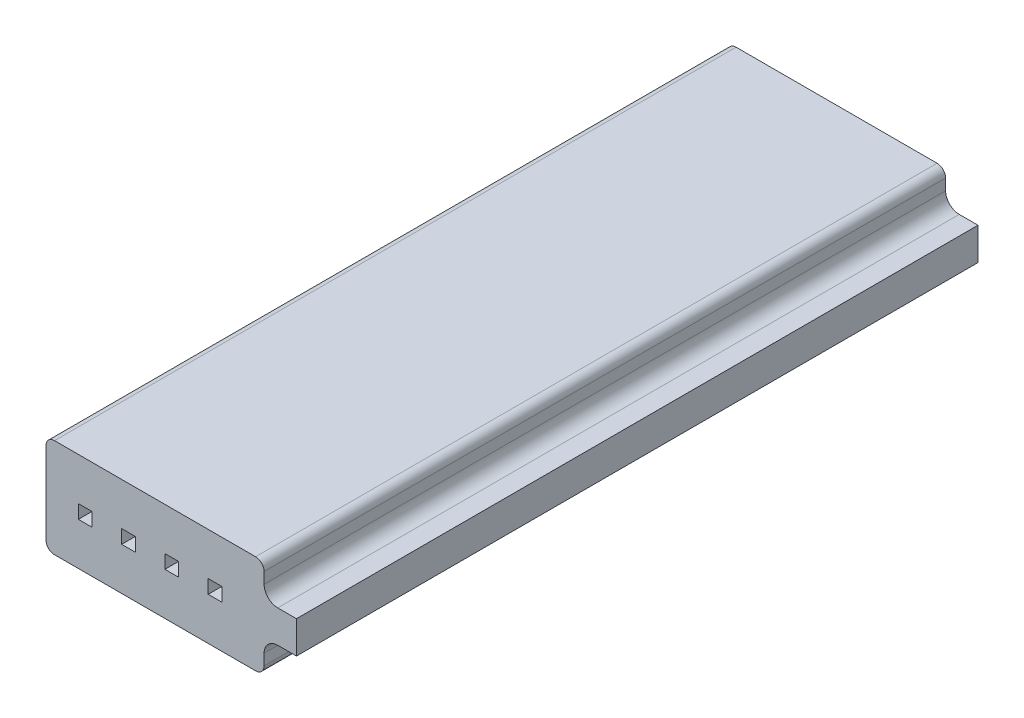
ISO-10303-21;
HEADER;
FILE_DESCRIPTION(('STEP AP214'),'2;1');
FILE_NAME('part.step','',(''),(''),'','','');
FILE_SCHEMA(('AUTOMOTIVE_DESIGN { 1 0 10303 214 1 1 1 1 }'));
ENDSEC;
DATA;
#1=APPLICATION_CONTEXT('core data for automotive mechanical design processes');
#2=APPLICATION_PROTOCOL_DEFINITION('international standard','automotive_design',2000,#1);
#3=PRODUCT_CONTEXT('',#1,'mechanical');
#4=PRODUCT('Part','Part','',(#3));
#5=PRODUCT_RELATED_PRODUCT_CATEGORY('part','',(#4));
#6=PRODUCT_DEFINITION_FORMATION('','',#4);
#7=PRODUCT_DEFINITION_CONTEXT('part definition',#1,'design');
#8=PRODUCT_DEFINITION('design','',#6,#7);
#9=PRODUCT_DEFINITION_SHAPE('','',#8);
#10=(LENGTH_UNIT() NAMED_UNIT(*) SI_UNIT(.MILLI.,.METRE.));
#11=(NAMED_UNIT(*) PLANE_ANGLE_UNIT() SI_UNIT($,.RADIAN.));
#12=(NAMED_UNIT(*) SI_UNIT($,.STERADIAN.) SOLID_ANGLE_UNIT());
#13=UNCERTAINTY_MEASURE_WITH_UNIT(LENGTH_MEASURE(1.E-05),#10,'distance_accuracy_value','');
#14=(GEOMETRIC_REPRESENTATION_CONTEXT(3) GLOBAL_UNCERTAINTY_ASSIGNED_CONTEXT((#13)) GLOBAL_UNIT_ASSIGNED_CONTEXT((#10,
#11,#12)) REPRESENTATION_CONTEXT('',''));
#15=CARTESIAN_POINT('',(0.,0.,0.));
#16=DIRECTION('',(0.,0.,1.));
#17=DIRECTION('',(1.,0.,0.));
#18=AXIS2_PLACEMENT_3D('',#15,#16,#17);
#19=CARTESIAN_POINT('',(3.91999999999999,0.4,40.));
#20=DIRECTION('',(0.,1.,0.));
#21=DIRECTION('',(0.,0.,1.));
#22=AXIS2_PLACEMENT_3D('',#19,#20,#21);
#23=PLANE('',#22);
#24=DIRECTION('',(1.,0.,0.));
#25=VECTOR('',#24,1.);
#26=CARTESIAN_POINT('',(3.91999999999999,0.4,0.));
#27=LINE('',#26,#25);
#28=CARTESIAN_POINT('',(3.11999999999999,0.4,0.));
#29=VERTEX_POINT('',#28);
#30=CARTESIAN_POINT('',(3.91999999999999,0.4,0.));
#31=VERTEX_POINT('',#30);
#32=EDGE_CURVE('E393',#29,#31,#27,.T.);
#33=ORIENTED_EDGE('',*,*,#32,.T.);
#34=DIRECTION('',(0.,0.,-1.));
#35=VECTOR('',#34,1.);
#36=CARTESIAN_POINT('',(3.91999999999999,0.4,40.));
#37=LINE('',#36,#35);
#38=CARTESIAN_POINT('',(3.91999999999999,0.4,40.));
#39=VERTEX_POINT('',#38);
#40=EDGE_CURVE('E414',#39,#31,#37,.T.);
#41=ORIENTED_EDGE('',*,*,#40,.F.);
#42=DIRECTION('',(1.,0.,0.));
#43=VECTOR('',#42,1.);
#44=CARTESIAN_POINT('',(3.91999999999999,0.4,40.));
#45=LINE('',#44,#43);
#46=CARTESIAN_POINT('',(3.11999999999999,0.4,40.));
#47=VERTEX_POINT('',#46);
#48=EDGE_CURVE('E398',#47,#39,#45,.T.);
#49=ORIENTED_EDGE('',*,*,#48,.F.);
#50=DIRECTION('',(0.,0.,-1.));
#51=VECTOR('',#50,1.);
#52=CARTESIAN_POINT('',(3.11999999999999,0.4,40.));
#53=LINE('',#52,#51);
#54=EDGE_CURVE('E405',#47,#29,#53,.T.);
#55=ORIENTED_EDGE('',*,*,#54,.T.);
#56=EDGE_LOOP('',(#33,#41,#49,#55));
#57=FACE_BOUND('',#56,.T.);
#58=ADVANCED_FACE('F36',(#57),#23,.F.);
#59=CARTESIAN_POINT('',(3.91999999999999,0.4,40.));
#60=DIRECTION('',(1.,0.,0.));
#61=DIRECTION('',(0.,0.,-1.));
#62=AXIS2_PLACEMENT_3D('',#59,#60,#61);
#63=PLANE('',#62);
#64=DIRECTION('',(0.,-1.,0.));
#65=VECTOR('',#64,1.);
#66=CARTESIAN_POINT('',(3.91999999999999,0.4,0.));
#67=LINE('',#66,#65);
#68=CARTESIAN_POINT('',(3.91999999999999,-0.4,0.));
#69=VERTEX_POINT('',#68);
#70=EDGE_CURVE('E390',#31,#69,#67,.T.);
#71=ORIENTED_EDGE('',*,*,#70,.T.);
#72=DIRECTION('',(0.,0.,-1.));
#73=VECTOR('',#72,1.);
#74=CARTESIAN_POINT('',(3.91999999999999,-0.4,40.));
#75=LINE('',#74,#73);
#76=CARTESIAN_POINT('',(3.91999999999999,-0.4,40.));
#77=VERTEX_POINT('',#76);
#78=EDGE_CURVE('E411',#77,#69,#75,.T.);
#79=ORIENTED_EDGE('',*,*,#78,.F.);
#80=DIRECTION('',(0.,-1.,0.));
#81=VECTOR('',#80,1.);
#82=CARTESIAN_POINT('',(3.91999999999999,0.4,40.));
#83=LINE('',#82,#81);
#84=EDGE_CURVE('E400',#39,#77,#83,.T.);
#85=ORIENTED_EDGE('',*,*,#84,.F.);
#86=ORIENTED_EDGE('',*,*,#40,.T.);
#87=EDGE_LOOP('',(#71,#79,#85,#86));
#88=FACE_BOUND('',#87,.T.);
#89=ADVANCED_FACE('F533',(#88),#63,.F.);
#90=CARTESIAN_POINT('',(3.91999999999999,-0.4,40.));
#91=DIRECTION('',(0.,-1.,0.));
#92=DIRECTION('',(0.,0.,-1.));
#93=AXIS2_PLACEMENT_3D('',#90,#91,#92);
#94=PLANE('',#93);
#95=DIRECTION('',(-1.,0.,0.));
#96=VECTOR('',#95,1.);
#97=CARTESIAN_POINT('',(3.91999999999999,-0.4,0.));
#98=LINE('',#97,#96);
#99=CARTESIAN_POINT('',(3.11999999999999,-0.4,0.));
#100=VERTEX_POINT('',#99);
#101=EDGE_CURVE('E387',#69,#100,#98,.T.);
#102=ORIENTED_EDGE('',*,*,#101,.T.);
#103=DIRECTION('',(0.,0.,-1.));
#104=VECTOR('',#103,1.);
#105=CARTESIAN_POINT('',(3.11999999999999,-0.4,40.));
#106=LINE('',#105,#104);
#107=CARTESIAN_POINT('',(3.11999999999999,-0.4,40.));
#108=VERTEX_POINT('',#107);
#109=EDGE_CURVE('E408',#108,#100,#106,.T.);
#110=ORIENTED_EDGE('',*,*,#109,.F.);
#111=DIRECTION('',(-1.,0.,0.));
#112=VECTOR('',#111,1.);
#113=CARTESIAN_POINT('',(3.91999999999999,-0.4,40.));
#114=LINE('',#113,#112);
#115=EDGE_CURVE('E402',#77,#108,#114,.T.);
#116=ORIENTED_EDGE('',*,*,#115,.F.);
#117=ORIENTED_EDGE('',*,*,#78,.T.);
#118=EDGE_LOOP('',(#102,#110,#116,#117));
#119=FACE_BOUND('',#118,.T.);
#120=ADVANCED_FACE('F539',(#119),#94,.F.);
#121=CARTESIAN_POINT('',(3.11999999999999,0.4,40.));
#122=DIRECTION('',(-1.,0.,0.));
#123=DIRECTION('',(0.,0.,1.));
#124=AXIS2_PLACEMENT_3D('',#121,#122,#123);
#125=PLANE('',#124);
#126=DIRECTION('',(0.,1.,0.));
#127=VECTOR('',#126,1.);
#128=CARTESIAN_POINT('',(3.11999999999999,0.4,0.));
#129=LINE('',#128,#127);
#130=EDGE_CURVE('E385',#100,#29,#129,.T.);
#131=ORIENTED_EDGE('',*,*,#130,.T.);
#132=ORIENTED_EDGE('',*,*,#54,.F.);
#133=DIRECTION('',(0.,1.,0.));
#134=VECTOR('',#133,1.);
#135=CARTESIAN_POINT('',(3.11999999999999,0.4,40.));
#136=LINE('',#135,#134);
#137=EDGE_CURVE('E396',#108,#47,#136,.T.);
#138=ORIENTED_EDGE('',*,*,#137,.F.);
#139=ORIENTED_EDGE('',*,*,#109,.T.);
#140=EDGE_LOOP('',(#131,#132,#138,#139));
#141=FACE_BOUND('',#140,.T.);
#142=ADVANCED_FACE('F654',(#141),#125,.F.);
#143=CARTESIAN_POINT('',(1.37999999999999,0.4,40.));
#144=DIRECTION('',(0.,1.,0.));
#145=DIRECTION('',(0.,0.,1.));
#146=AXIS2_PLACEMENT_3D('',#143,#144,#145);
#147=PLANE('',#146);
#148=DIRECTION('',(1.,0.,0.));
#149=VECTOR('',#148,1.);
#150=CARTESIAN_POINT('',(1.37999999999999,0.4,0.));
#151=LINE('',#150,#149);
#152=CARTESIAN_POINT('',(0.579999999999991,0.4,0.));
#153=VERTEX_POINT('',#152);
#154=CARTESIAN_POINT('',(1.37999999999999,0.4,0.));
#155=VERTEX_POINT('',#154);
#156=EDGE_CURVE('E361',#153,#155,#151,.T.);
#157=ORIENTED_EDGE('',*,*,#156,.T.);
#158=DIRECTION('',(0.,0.,-1.));
#159=VECTOR('',#158,1.);
#160=CARTESIAN_POINT('',(1.37999999999999,0.4,40.));
#161=LINE('',#160,#159);
#162=CARTESIAN_POINT('',(1.37999999999999,0.4,40.));
#163=VERTEX_POINT('',#162);
#164=EDGE_CURVE('E382',#163,#155,#161,.T.);
#165=ORIENTED_EDGE('',*,*,#164,.F.);
#166=DIRECTION('',(1.,0.,0.));
#167=VECTOR('',#166,1.);
#168=CARTESIAN_POINT('',(1.37999999999999,0.4,40.));
#169=LINE('',#168,#167);
#170=CARTESIAN_POINT('',(0.579999999999991,0.4,40.));
#171=VERTEX_POINT('',#170);
#172=EDGE_CURVE('E366',#171,#163,#169,.T.);
#173=ORIENTED_EDGE('',*,*,#172,.F.);
#174=DIRECTION('',(0.,0.,-1.));
#175=VECTOR('',#174,1.);
#176=CARTESIAN_POINT('',(0.579999999999991,0.4,40.));
#177=LINE('',#176,#175);
#178=EDGE_CURVE('E373',#171,#153,#177,.T.);
#179=ORIENTED_EDGE('',*,*,#178,.T.);
#180=EDGE_LOOP('',(#157,#165,#173,#179));
#181=FACE_BOUND('',#180,.T.);
#182=ADVANCED_FACE('F645',(#181),#147,.F.);
#183=CARTESIAN_POINT('',(1.37999999999999,0.4,40.));
#184=DIRECTION('',(1.,0.,0.));
#185=DIRECTION('',(0.,0.,-1.));
#186=AXIS2_PLACEMENT_3D('',#183,#184,#185);
#187=PLANE('',#186);
#188=DIRECTION('',(0.,-1.,0.));
#189=VECTOR('',#188,1.);
#190=CARTESIAN_POINT('',(1.37999999999999,0.4,0.));
#191=LINE('',#190,#189);
#192=CARTESIAN_POINT('',(1.37999999999999,-0.4,0.));
#193=VERTEX_POINT('',#192);
#194=EDGE_CURVE('E358',#155,#193,#191,.T.);
#195=ORIENTED_EDGE('',*,*,#194,.T.);
#196=DIRECTION('',(0.,0.,-1.));
#197=VECTOR('',#196,1.);
#198=CARTESIAN_POINT('',(1.37999999999999,-0.4,40.));
#199=LINE('',#198,#197);
#200=CARTESIAN_POINT('',(1.37999999999999,-0.4,40.));
#201=VERTEX_POINT('',#200);
#202=EDGE_CURVE('E379',#201,#193,#199,.T.);
#203=ORIENTED_EDGE('',*,*,#202,.F.);
#204=DIRECTION('',(0.,-1.,0.));
#205=VECTOR('',#204,1.);
#206=CARTESIAN_POINT('',(1.37999999999999,0.4,40.));
#207=LINE('',#206,#205);
#208=EDGE_CURVE('E368',#163,#201,#207,.T.);
#209=ORIENTED_EDGE('',*,*,#208,.F.);
#210=ORIENTED_EDGE('',*,*,#164,.T.);
#211=EDGE_LOOP('',(#195,#203,#209,#210));
#212=FACE_BOUND('',#211,.T.);
#213=ADVANCED_FACE('F636',(#212),#187,.F.);
#214=CARTESIAN_POINT('',(1.37999999999999,-0.4,40.));
#215=DIRECTION('',(0.,-1.,0.));
#216=DIRECTION('',(0.,0.,-1.));
#217=AXIS2_PLACEMENT_3D('',#214,#215,#216);
#218=PLANE('',#217);
#219=DIRECTION('',(-1.,0.,0.));
#220=VECTOR('',#219,1.);
#221=CARTESIAN_POINT('',(1.37999999999999,-0.4,0.));
#222=LINE('',#221,#220);
#223=CARTESIAN_POINT('',(0.579999999999991,-0.4,0.));
#224=VERTEX_POINT('',#223);
#225=EDGE_CURVE('E355',#193,#224,#222,.T.);
#226=ORIENTED_EDGE('',*,*,#225,.T.);
#227=DIRECTION('',(0.,0.,-1.));
#228=VECTOR('',#227,1.);
#229=CARTESIAN_POINT('',(0.579999999999991,-0.4,40.));
#230=LINE('',#229,#228);
#231=CARTESIAN_POINT('',(0.579999999999991,-0.4,40.));
#232=VERTEX_POINT('',#231);
#233=EDGE_CURVE('E376',#232,#224,#230,.T.);
#234=ORIENTED_EDGE('',*,*,#233,.F.);
#235=DIRECTION('',(-1.,0.,0.));
#236=VECTOR('',#235,1.);
#237=CARTESIAN_POINT('',(1.37999999999999,-0.4,40.));
#238=LINE('',#237,#236);
#239=EDGE_CURVE('E370',#201,#232,#238,.T.);
#240=ORIENTED_EDGE('',*,*,#239,.F.);
#241=ORIENTED_EDGE('',*,*,#202,.T.);
#242=EDGE_LOOP('',(#226,#234,#240,#241));
#243=FACE_BOUND('',#242,.T.);
#244=ADVANCED_FACE('F627',(#243),#218,.F.);
#245=CARTESIAN_POINT('',(0.579999999999991,0.4,40.));
#246=DIRECTION('',(-1.,0.,0.));
#247=DIRECTION('',(0.,0.,1.));
#248=AXIS2_PLACEMENT_3D('',#245,#246,#247);
#249=PLANE('',#248);
#250=DIRECTION('',(0.,1.,0.));
#251=VECTOR('',#250,1.);
#252=CARTESIAN_POINT('',(0.579999999999991,0.4,0.));
#253=LINE('',#252,#251);
#254=EDGE_CURVE('E353',#224,#153,#253,.T.);
#255=ORIENTED_EDGE('',*,*,#254,.T.);
#256=ORIENTED_EDGE('',*,*,#178,.F.);
#257=DIRECTION('',(0.,1.,0.));
#258=VECTOR('',#257,1.);
#259=CARTESIAN_POINT('',(0.579999999999991,0.4,40.));
#260=LINE('',#259,#258);
#261=EDGE_CURVE('E364',#232,#171,#260,.T.);
#262=ORIENTED_EDGE('',*,*,#261,.F.);
#263=ORIENTED_EDGE('',*,*,#233,.T.);
#264=EDGE_LOOP('',(#255,#256,#262,#263));
#265=FACE_BOUND('',#264,.T.);
#266=ADVANCED_FACE('F622',(#265),#249,.F.);
#267=CARTESIAN_POINT('',(6.39999999999999,-0.950000000000005,40.));
#268=DIRECTION('',(-1.,0.,0.));
#269=DIRECTION('',(0.,0.,1.));
#270=AXIS2_PLACEMENT_3D('',#267,#268,#269);
#271=PLANE('',#270);
#272=DIRECTION('',(0.,1.,0.));
#273=VECTOR('',#272,1.);
#274=CARTESIAN_POINT('',(6.39999999999999,-0.950000000000005,40.));
#275=LINE('',#274,#273);
#276=CARTESIAN_POINT('',(6.39999999999999,-2.4,40.));
#277=VERTEX_POINT('',#276);
#278=CARTESIAN_POINT('',(6.39999999999999,-1.75,40.));
#279=VERTEX_POINT('',#278);
#280=EDGE_CURVE('E309',#277,#279,#275,.T.);
#281=ORIENTED_EDGE('',*,*,#280,.F.);
#282=DIRECTION('',(0.,0.,-1.));
#283=VECTOR('',#282,1.);
#284=CARTESIAN_POINT('',(6.39999999999999,-2.4,40.));
#285=LINE('',#284,#283);
#286=CARTESIAN_POINT('',(6.39999999999999,-2.4,0.));
#287=VERTEX_POINT('',#286);
#288=EDGE_CURVE('E437',#277,#287,#285,.T.);
#289=ORIENTED_EDGE('',*,*,#288,.T.);
#290=DIRECTION('',(0.,1.,0.));
#291=VECTOR('',#290,1.);
#292=CARTESIAN_POINT('',(6.39999999999999,-0.950000000000005,0.));
#293=LINE('',#292,#291);
#294=CARTESIAN_POINT('',(6.39999999999999,-1.75,0.));
#295=VERTEX_POINT('',#294);
#296=EDGE_CURVE('E302',#287,#295,#293,.T.);
#297=ORIENTED_EDGE('',*,*,#296,.T.);
#298=DIRECTION('',(0.,0.,-1.));
#299=VECTOR('',#298,1.);
#300=CARTESIAN_POINT('',(6.39999999999999,-1.75,40.));
#301=LINE('',#300,#299);
#302=EDGE_CURVE('E420',#295,#279,#301,.F.);
#303=ORIENTED_EDGE('',*,*,#302,.T.);
#304=EDGE_LOOP('',(#281,#289,#297,#303));
#305=FACE_BOUND('',#304,.T.);
#306=ADVANCED_FACE('F498',(#305),#271,.F.);
#307=CARTESIAN_POINT('',(8.29999999999999,-0.949999999999996,40.));
#308=DIRECTION('',(0.,1.,0.));
#309=DIRECTION('',(-1.,0.,0.));
#310=AXIS2_PLACEMENT_3D('',#307,#308,#309);
#311=PLANE('',#310);
#312=DIRECTION('',(1.,0.,0.));
#313=VECTOR('',#312,1.);
#314=CARTESIAN_POINT('',(8.29999999999999,-0.949999999999996,40.));
#315=LINE('',#314,#313);
#316=CARTESIAN_POINT('',(7.19999999999999,-0.950000000000001,40.));
#317=VERTEX_POINT('',#316);
#318=CARTESIAN_POINT('',(8.29999999999999,-0.949999999999996,40.));
#319=VERTEX_POINT('',#318);
#320=EDGE_CURVE('E311',#317,#319,#315,.T.);
#321=ORIENTED_EDGE('',*,*,#320,.F.);
#322=DIRECTION('',(0.,0.,-1.));
#323=VECTOR('',#322,1.);
#324=CARTESIAN_POINT('',(7.19999999999999,-0.950000000000001,0.));
#325=LINE('',#324,#323);
#326=CARTESIAN_POINT('',(7.19999999999999,-0.950000000000001,0.));
#327=VERTEX_POINT('',#326);
#328=EDGE_CURVE('E417',#317,#327,#325,.T.);
#329=ORIENTED_EDGE('',*,*,#328,.T.);
#330=DIRECTION('',(1.,0.,0.));
#331=VECTOR('',#330,1.);
#332=CARTESIAN_POINT('',(8.29999999999999,-0.949999999999996,0.));
#333=LINE('',#332,#331);
#334=CARTESIAN_POINT('',(8.29999999999999,-0.949999999999996,0.));
#335=VERTEX_POINT('',#334);
#336=EDGE_CURVE('E331',#327,#335,#333,.T.);
#337=ORIENTED_EDGE('',*,*,#336,.T.);
#338=DIRECTION('',(0.,0.,-1.));
#339=VECTOR('',#338,1.);
#340=CARTESIAN_POINT('',(8.29999999999999,-0.949999999999996,40.));
#341=LINE('',#340,#339);
#342=EDGE_CURVE('E350',#319,#335,#341,.T.);
#343=ORIENTED_EDGE('',*,*,#342,.F.);
#344=EDGE_LOOP('',(#321,#329,#337,#343));
#345=FACE_BOUND('',#344,.T.);
#346=ADVANCED_FACE('F509',(#345),#311,.F.);
#347=CARTESIAN_POINT('',(8.29999999999999,0.950000000000004,40.));
#348=DIRECTION('',(-1.,0.,0.));
#349=DIRECTION('',(0.,0.,1.));
#350=AXIS2_PLACEMENT_3D('',#347,#348,#349);
#351=PLANE('',#350);
#352=DIRECTION('',(0.,1.,0.));
#353=VECTOR('',#352,1.);
#354=CARTESIAN_POINT('',(8.29999999999999,0.950000000000004,0.));
#355=LINE('',#354,#353);
#356=CARTESIAN_POINT('',(8.29999999999999,0.950000000000004,0.));
#357=VERTEX_POINT('',#356);
#358=EDGE_CURVE('E333',#335,#357,#355,.T.);
#359=ORIENTED_EDGE('',*,*,#358,.T.);
#360=DIRECTION('',(0.,0.,-1.));
#361=VECTOR('',#360,1.);
#362=CARTESIAN_POINT('',(8.29999999999999,0.950000000000004,40.));
#363=LINE('',#362,#361);
#364=CARTESIAN_POINT('',(8.29999999999999,0.950000000000004,40.));
#365=VERTEX_POINT('',#364);
#366=EDGE_CURVE('E329',#365,#357,#363,.T.);
#367=ORIENTED_EDGE('',*,*,#366,.F.);
#368=DIRECTION('',(0.,1.,0.));
#369=VECTOR('',#368,1.);
#370=CARTESIAN_POINT('',(8.29999999999999,0.950000000000004,40.));
#371=LINE('',#370,#369);
#372=EDGE_CURVE('E314',#319,#365,#371,.T.);
#373=ORIENTED_EDGE('',*,*,#372,.F.);
#374=ORIENTED_EDGE('',*,*,#342,.T.);
#375=EDGE_LOOP('',(#359,#367,#373,#374));
#376=FACE_BOUND('',#375,.T.);
#377=ADVANCED_FACE('F513',(#376),#351,.F.);
#378=CARTESIAN_POINT('',(6.39999999999999,0.950000000000004,40.));
#379=DIRECTION('',(0.,-1.,0.));
#380=DIRECTION('',(0.,0.,-1.));
#381=AXIS2_PLACEMENT_3D('',#378,#379,#380);
#382=PLANE('',#381);
#383=DIRECTION('',(-1.,0.,0.));
#384=VECTOR('',#383,1.);
#385=CARTESIAN_POINT('',(6.39999999999999,0.950000000000004,0.));
#386=LINE('',#385,#384);
#387=CARTESIAN_POINT('',(7.19999999999999,0.950000000000004,0.));
#388=VERTEX_POINT('',#387);
#389=EDGE_CURVE('E335',#357,#388,#386,.T.);
#390=ORIENTED_EDGE('',*,*,#389,.T.);
#391=DIRECTION('',(0.,0.,-1.));
#392=VECTOR('',#391,1.);
#393=CARTESIAN_POINT('',(7.19999999999999,0.950000000000004,40.));
#394=LINE('',#393,#392);
#395=CARTESIAN_POINT('',(7.19999999999999,0.950000000000004,40.));
#396=VERTEX_POINT('',#395);
#397=EDGE_CURVE('E426',#388,#396,#394,.F.);
#398=ORIENTED_EDGE('',*,*,#397,.T.);
#399=DIRECTION('',(-1.,0.,0.));
#400=VECTOR('',#399,1.);
#401=CARTESIAN_POINT('',(6.39999999999999,0.950000000000004,40.));
#402=LINE('',#401,#400);
#403=EDGE_CURVE('E316',#365,#396,#402,.T.);
#404=ORIENTED_EDGE('',*,*,#403,.F.);
#405=ORIENTED_EDGE('',*,*,#366,.T.);
#406=EDGE_LOOP('',(#390,#398,#404,#405));
#407=FACE_BOUND('',#406,.T.);
#408=ADVANCED_FACE('F758',(#407),#382,.F.);
#409=CARTESIAN_POINT('',(6.39999999999999,2.9,40.));
#410=DIRECTION('',(-1.,0.,0.));
#411=DIRECTION('',(0.,-1.,0.));
#412=AXIS2_PLACEMENT_3D('',#409,#410,#411);
#413=PLANE('',#412);
#414=DIRECTION('',(0.,1.,0.));
#415=VECTOR('',#414,1.);
#416=CARTESIAN_POINT('',(6.39999999999999,2.9,0.));
#417=LINE('',#416,#415);
#418=CARTESIAN_POINT('',(6.39999999999999,1.75,0.));
#419=VERTEX_POINT('',#418);
#420=CARTESIAN_POINT('',(6.39999999999999,2.4,0.));
#421=VERTEX_POINT('',#420);
#422=EDGE_CURVE('E338',#419,#421,#417,.T.);
#423=ORIENTED_EDGE('',*,*,#422,.T.);
#424=DIRECTION('',(0.,0.,-1.));
#425=VECTOR('',#424,1.);
#426=CARTESIAN_POINT('',(6.39999999999999,2.4,40.));
#427=LINE('',#426,#425);
#428=CARTESIAN_POINT('',(6.39999999999999,2.4,40.));
#429=VERTEX_POINT('',#428);
#430=EDGE_CURVE('E11',#421,#429,#427,.F.);
#431=ORIENTED_EDGE('',*,*,#430,.T.);
#432=DIRECTION('',(0.,1.,0.));
#433=VECTOR('',#432,1.);
#434=CARTESIAN_POINT('',(6.39999999999999,2.9,40.));
#435=LINE('',#434,#433);
#436=CARTESIAN_POINT('',(6.39999999999999,1.75,40.));
#437=VERTEX_POINT('',#436);
#438=EDGE_CURVE('E319',#437,#429,#435,.T.);
#439=ORIENTED_EDGE('',*,*,#438,.F.);
#440=DIRECTION('',(0.,0.,-1.));
#441=VECTOR('',#440,1.);
#442=CARTESIAN_POINT('',(6.39999999999999,1.75,0.));
#443=LINE('',#442,#441);
#444=EDGE_CURVE('E423',#437,#419,#443,.T.);
#445=ORIENTED_EDGE('',*,*,#444,.T.);
#446=EDGE_LOOP('',(#423,#431,#439,#445));
#447=FACE_BOUND('',#446,.T.);
#448=ADVANCED_FACE('F524',(#447),#413,.F.);
#449=CARTESIAN_POINT('',(-6.40000000000001,2.9,40.));
#450=DIRECTION('',(0.,-1.,0.));
#451=DIRECTION('',(1.,0.,0.));
#452=AXIS2_PLACEMENT_3D('',#449,#450,#451);
#453=PLANE('',#452);
#454=DIRECTION('',(-1.,0.,0.));
#455=VECTOR('',#454,1.);
#456=CARTESIAN_POINT('',(-6.40000000000001,2.9,0.));
#457=LINE('',#456,#455);
#458=CARTESIAN_POINT('',(5.89999999999999,2.9,0.));
#459=VERTEX_POINT('',#458);
#460=CARTESIAN_POINT('',(-5.90000000000001,2.9,0.));
#461=VERTEX_POINT('',#460);
#462=EDGE_CURVE('E341',#459,#461,#457,.T.);
#463=ORIENTED_EDGE('',*,*,#462,.T.);
#464=DIRECTION('',(0.,0.,-1.));
#465=VECTOR('',#464,1.);
#466=CARTESIAN_POINT('',(-5.90000000000001,2.9,40.));
#467=LINE('',#466,#465);
#468=CARTESIAN_POINT('',(-5.90000000000001,2.9,40.));
#469=VERTEX_POINT('',#468);
#470=EDGE_CURVE('E44',#461,#469,#467,.F.);
#471=ORIENTED_EDGE('',*,*,#470,.T.);
#472=DIRECTION('',(-1.,0.,0.));
#473=VECTOR('',#472,1.);
#474=CARTESIAN_POINT('',(-6.40000000000001,2.9,40.));
#475=LINE('',#474,#473);
#476=CARTESIAN_POINT('',(5.89999999999999,2.9,40.));
#477=VERTEX_POINT('',#476);
#478=EDGE_CURVE('E322',#477,#469,#475,.T.);
#479=ORIENTED_EDGE('',*,*,#478,.F.);
#480=DIRECTION('',(0.,0.,-1.));
#481=VECTOR('',#480,1.);
#482=CARTESIAN_POINT('',(5.89999999999999,2.9,40.));
#483=LINE('',#482,#481);
#484=EDGE_CURVE('E464',#477,#459,#483,.T.);
#485=ORIENTED_EDGE('',*,*,#484,.T.);
#486=EDGE_LOOP('',(#463,#471,#479,#485));
#487=FACE_BOUND('',#486,.T.);
#488=ADVANCED_FACE('F469',(#487),#453,.F.);
#489=CARTESIAN_POINT('',(-6.40000000000001,2.9,40.));
#490=DIRECTION('',(1.,0.,0.));
#491=DIRECTION('',(0.,0.,-1.));
#492=AXIS2_PLACEMENT_3D('',#489,#490,#491);
#493=PLANE('',#492);
#494=DIRECTION('',(0.,-1.,0.));
#495=VECTOR('',#494,1.);
#496=CARTESIAN_POINT('',(-6.40000000000001,2.9,0.));
#497=LINE('',#496,#495);
#498=CARTESIAN_POINT('',(-6.40000000000001,2.4,0.));
#499=VERTEX_POINT('',#498);
#500=CARTESIAN_POINT('',(-6.40000000000001,-2.4,0.));
#501=VERTEX_POINT('',#500);
#502=EDGE_CURVE('E344',#499,#501,#497,.T.);
#503=ORIENTED_EDGE('',*,*,#502,.T.);
#504=DIRECTION('',(0.,0.,-1.));
#505=VECTOR('',#504,1.);
#506=CARTESIAN_POINT('',(-6.40000000000001,-2.4,40.));
#507=LINE('',#506,#505);
#508=CARTESIAN_POINT('',(-6.40000000000001,-2.4,40.));
#509=VERTEX_POINT('',#508);
#510=EDGE_CURVE('E51',#501,#509,#507,.F.);
#511=ORIENTED_EDGE('',*,*,#510,.T.);
#512=DIRECTION('',(0.,-1.,0.));
#513=VECTOR('',#512,1.);
#514=CARTESIAN_POINT('',(-6.40000000000001,2.9,40.));
#515=LINE('',#514,#513);
#516=CARTESIAN_POINT('',(-6.40000000000001,2.4,40.));
#517=VERTEX_POINT('',#516);
#518=EDGE_CURVE('E324',#517,#509,#515,.T.);
#519=ORIENTED_EDGE('',*,*,#518,.F.);
#520=DIRECTION('',(0.,0.,-1.));
#521=VECTOR('',#520,1.);
#522=CARTESIAN_POINT('',(-6.40000000000001,2.4,40.));
#523=LINE('',#522,#521);
#524=EDGE_CURVE('E460',#517,#499,#523,.T.);
#525=ORIENTED_EDGE('',*,*,#524,.T.);
#526=EDGE_LOOP('',(#503,#511,#519,#525));
#527=FACE_BOUND('',#526,.T.);
#528=ADVANCED_FACE('F479',(#527),#493,.F.);
#529=CARTESIAN_POINT('',(-6.40000000000001,-2.9,40.));
#530=DIRECTION('',(0.,1.,0.));
#531=DIRECTION('',(-1.,0.,0.));
#532=AXIS2_PLACEMENT_3D('',#529,#530,#531);
#533=PLANE('',#532);
#534=DIRECTION('',(1.,0.,0.));
#535=VECTOR('',#534,1.);
#536=CARTESIAN_POINT('',(-6.40000000000001,-2.9,0.));
#537=LINE('',#536,#535);
#538=CARTESIAN_POINT('',(-5.90000000000001,-2.9,0.));
#539=VERTEX_POINT('',#538);
#540=CARTESIAN_POINT('',(5.89999999999999,-2.9,0.));
#541=VERTEX_POINT('',#540);
#542=EDGE_CURVE('E312',#539,#541,#537,.T.);
#543=ORIENTED_EDGE('',*,*,#542,.T.);
#544=DIRECTION('',(0.,0.,-1.));
#545=VECTOR('',#544,1.);
#546=CARTESIAN_POINT('',(5.89999999999999,-2.9,40.));
#547=LINE('',#546,#545);
#548=CARTESIAN_POINT('',(5.89999999999999,-2.9,40.));
#549=VERTEX_POINT('',#548);
#550=EDGE_CURVE('E451',#541,#549,#547,.F.);
#551=ORIENTED_EDGE('',*,*,#550,.T.);
#552=DIRECTION('',(1.,0.,0.));
#553=VECTOR('',#552,1.);
#554=CARTESIAN_POINT('',(-6.40000000000001,-2.9,40.));
#555=LINE('',#554,#553);
#556=CARTESIAN_POINT('',(-5.90000000000001,-2.9,40.));
#557=VERTEX_POINT('',#556);
#558=EDGE_CURVE('E326',#557,#549,#555,.T.);
#559=ORIENTED_EDGE('',*,*,#558,.F.);
#560=DIRECTION('',(0.,0.,-1.));
#561=VECTOR('',#560,1.);
#562=CARTESIAN_POINT('',(-5.90000000000001,-2.9,40.));
#563=LINE('',#562,#561);
#564=EDGE_CURVE('E448',#557,#539,#563,.T.);
#565=ORIENTED_EDGE('',*,*,#564,.T.);
#566=EDGE_LOOP('',(#543,#551,#559,#565));
#567=FACE_BOUND('',#566,.T.);
#568=ADVANCED_FACE('F490',(#567),#533,.F.);
#569=CARTESIAN_POINT('',(0.,0.,40.));
#570=DIRECTION('',(0.,0.,1.));
#571=DIRECTION('',(1.,0.,0.));
#572=AXIS2_PLACEMENT_3D('',#569,#570,#571);
#573=PLANE('',#572);
#574=DIRECTION('',(0.,1.,0.));
#575=VECTOR('',#574,1.);
#576=CARTESIAN_POINT('',(-1.96000000000001,0.4,40.));
#577=LINE('',#576,#575);
#578=CARTESIAN_POINT('',(-1.96000000000001,-0.4,40.));
#579=VERTEX_POINT('',#578);
#580=CARTESIAN_POINT('',(-1.96000000000001,0.4,40.));
#581=VERTEX_POINT('',#580);
#582=EDGE_CURVE('E273',#579,#581,#577,.T.);
#583=ORIENTED_EDGE('',*,*,#582,.T.);
#584=DIRECTION('',(1.,0.,0.));
#585=VECTOR('',#584,1.);
#586=CARTESIAN_POINT('',(-1.16000000000001,0.4,40.));
#587=LINE('',#586,#585);
#588=CARTESIAN_POINT('',(-1.16000000000001,0.4,40.));
#589=VERTEX_POINT('',#588);
#590=EDGE_CURVE('E245',#581,#589,#587,.T.);
#591=ORIENTED_EDGE('',*,*,#590,.T.);
#592=DIRECTION('',(0.,-1.,0.));
#593=VECTOR('',#592,1.);
#594=CARTESIAN_POINT('',(-1.16000000000001,0.4,40.));
#595=LINE('',#594,#593);
#596=CARTESIAN_POINT('',(-1.16000000000001,-0.4,40.));
#597=VERTEX_POINT('',#596);
#598=EDGE_CURVE('E252',#589,#597,#595,.T.);
#599=ORIENTED_EDGE('',*,*,#598,.T.);
#600=DIRECTION('',(-1.,0.,0.));
#601=VECTOR('',#600,1.);
#602=CARTESIAN_POINT('',(-1.16000000000001,-0.4,40.));
#603=LINE('',#602,#601);
#604=EDGE_CURVE('E268',#597,#579,#603,.T.);
#605=ORIENTED_EDGE('',*,*,#604,.T.);
#606=EDGE_LOOP('',(#583,#591,#599,#605));
#607=FACE_BOUND('',#606,.T.);
#608=DIRECTION('',(0.,1.,0.));
#609=VECTOR('',#608,1.);
#610=CARTESIAN_POINT('',(-4.50000000000001,0.4,40.));
#611=LINE('',#610,#609);
#612=CARTESIAN_POINT('',(-4.50000000000001,-0.4,40.));
#613=VERTEX_POINT('',#612);
#614=CARTESIAN_POINT('',(-4.50000000000001,0.4,40.));
#615=VERTEX_POINT('',#614);
#616=EDGE_CURVE('E277',#613,#615,#611,.T.);
#617=ORIENTED_EDGE('',*,*,#616,.T.);
#618=DIRECTION('',(1.,0.,0.));
#619=VECTOR('',#618,1.);
#620=CARTESIAN_POINT('',(-3.70000000000001,0.4,40.));
#621=LINE('',#620,#619);
#622=CARTESIAN_POINT('',(-3.70000000000001,0.4,40.));
#623=VERTEX_POINT('',#622);
#624=EDGE_CURVE('E280',#615,#623,#621,.T.);
#625=ORIENTED_EDGE('',*,*,#624,.T.);
#626=DIRECTION('',(0.,-1.,0.));
#627=VECTOR('',#626,1.);
#628=CARTESIAN_POINT('',(-3.70000000000001,0.4,40.));
#629=LINE('',#628,#627);
#630=CARTESIAN_POINT('',(-3.70000000000001,-0.4,40.));
#631=VERTEX_POINT('',#630);
#632=EDGE_CURVE('E284',#623,#631,#629,.T.);
#633=ORIENTED_EDGE('',*,*,#632,.T.);
#634=DIRECTION('',(-1.,0.,0.));
#635=VECTOR('',#634,1.);
#636=CARTESIAN_POINT('',(-3.70000000000001,-0.4,40.));
#637=LINE('',#636,#635);
#638=EDGE_CURVE('E287',#631,#613,#637,.T.);
#639=ORIENTED_EDGE('',*,*,#638,.T.);
#640=EDGE_LOOP('',(#617,#625,#633,#639));
#641=FACE_BOUND('',#640,.T.);
#642=ORIENTED_EDGE('',*,*,#558,.T.);
#643=CARTESIAN_POINT('',(5.89999999999999,-2.4,40.));
#644=DIRECTION('',(0.,0.,1.));
#645=DIRECTION('',(1.,0.,0.));
#646=AXIS2_PLACEMENT_3D('',#643,#644,#645);
#647=CIRCLE('',#646,0.5);
#648=EDGE_CURVE('E458',#549,#277,#647,.T.);
#649=ORIENTED_EDGE('',*,*,#648,.T.);
#650=ORIENTED_EDGE('',*,*,#280,.T.);
#651=CARTESIAN_POINT('',(7.19999999999999,-1.75,40.));
#652=DIRECTION('',(0.,0.,1.));
#653=DIRECTION('',(1.,0.,0.));
#654=AXIS2_PLACEMENT_3D('',#651,#652,#653);
#655=CIRCLE('',#654,0.8);
#656=EDGE_CURVE('E431',#279,#317,#655,.F.);
#657=ORIENTED_EDGE('',*,*,#656,.T.);
#658=ORIENTED_EDGE('',*,*,#320,.T.);
#659=ORIENTED_EDGE('',*,*,#372,.T.);
#660=ORIENTED_EDGE('',*,*,#403,.T.);
#661=CARTESIAN_POINT('',(7.19999999999999,1.75,40.));
#662=DIRECTION('',(0.,0.,1.));
#663=DIRECTION('',(1.,0.,0.));
#664=AXIS2_PLACEMENT_3D('',#661,#662,#663);
#665=CIRCLE('',#664,0.8);
#666=EDGE_CURVE('E435',#396,#437,#665,.F.);
#667=ORIENTED_EDGE('',*,*,#666,.T.);
#668=ORIENTED_EDGE('',*,*,#438,.T.);
#669=CARTESIAN_POINT('',(5.89999999999999,2.4,40.));
#670=DIRECTION('',(0.,0.,1.));
#671=DIRECTION('',(1.,0.,0.));
#672=AXIS2_PLACEMENT_3D('',#669,#670,#671);
#673=CIRCLE('',#672,0.5);
#674=EDGE_CURVE('E453',#429,#477,#673,.T.);
#675=ORIENTED_EDGE('',*,*,#674,.T.);
#676=ORIENTED_EDGE('',*,*,#478,.T.);
#677=CARTESIAN_POINT('',(-5.90000000000001,2.4,40.));
#678=DIRECTION('',(0.,0.,1.));
#679=DIRECTION('',(1.,0.,0.));
#680=AXIS2_PLACEMENT_3D('',#677,#678,#679);
#681=CIRCLE('',#680,0.5);
#682=EDGE_CURVE('E58',#469,#517,#681,.T.);
#683=ORIENTED_EDGE('',*,*,#682,.T.);
#684=ORIENTED_EDGE('',*,*,#518,.T.);
#685=CARTESIAN_POINT('',(-5.90000000000001,-2.4,40.));
#686=DIRECTION('',(0.,0.,1.));
#687=DIRECTION('',(1.,0.,0.));
#688=AXIS2_PLACEMENT_3D('',#685,#686,#687);
#689=CIRCLE('',#688,0.5);
#690=EDGE_CURVE('E456',#509,#557,#689,.T.);
#691=ORIENTED_EDGE('',*,*,#690,.T.);
#692=EDGE_LOOP('',(#642,#649,#650,#657,#658,#659,#660,#667,#668,#675,#676,#683,#684,#691));
#693=FACE_BOUND('',#692,.T.);
#694=ORIENTED_EDGE('',*,*,#261,.T.);
#695=ORIENTED_EDGE('',*,*,#172,.T.);
#696=ORIENTED_EDGE('',*,*,#208,.T.);
#697=ORIENTED_EDGE('',*,*,#239,.T.);
#698=EDGE_LOOP('',(#694,#695,#696,#697));
#699=FACE_BOUND('',#698,.T.);
#700=ORIENTED_EDGE('',*,*,#137,.T.);
#701=ORIENTED_EDGE('',*,*,#48,.T.);
#702=ORIENTED_EDGE('',*,*,#84,.T.);
#703=ORIENTED_EDGE('',*,*,#115,.T.);
#704=EDGE_LOOP('',(#700,#701,#702,#703));
#705=FACE_BOUND('',#704,.T.);
#706=ADVANCED_FACE('F473',(#607,#641,#693,#699,#705),#573,.T.);
#707=CARTESIAN_POINT('',(0.,0.,0.));
#708=DIRECTION('',(0.,0.,1.));
#709=DIRECTION('',(1.,0.,0.));
#710=AXIS2_PLACEMENT_3D('',#707,#708,#709);
#711=PLANE('',#710);
#712=DIRECTION('',(1.,0.,0.));
#713=VECTOR('',#712,1.);
#714=CARTESIAN_POINT('',(-1.16000000000001,0.4,0.));
#715=LINE('',#714,#713);
#716=CARTESIAN_POINT('',(-1.96000000000001,0.4,0.));
#717=VERTEX_POINT('',#716);
#718=CARTESIAN_POINT('',(-1.16000000000001,0.4,0.));
#719=VERTEX_POINT('',#718);
#720=EDGE_CURVE('E235',#717,#719,#715,.T.);
#721=ORIENTED_EDGE('',*,*,#720,.F.);
#722=DIRECTION('',(0.,1.,0.));
#723=VECTOR('',#722,1.);
#724=CARTESIAN_POINT('',(-1.96000000000001,0.4,0.));
#725=LINE('',#724,#723);
#726=CARTESIAN_POINT('',(-1.96000000000001,-0.4,0.));
#727=VERTEX_POINT('',#726);
#728=EDGE_CURVE('E271',#727,#717,#725,.T.);
#729=ORIENTED_EDGE('',*,*,#728,.F.);
#730=DIRECTION('',(-1.,0.,0.));
#731=VECTOR('',#730,1.);
#732=CARTESIAN_POINT('',(-1.16000000000001,-0.4,0.));
#733=LINE('',#732,#731);
#734=CARTESIAN_POINT('',(-1.16000000000001,-0.4,0.));
#735=VERTEX_POINT('',#734);
#736=EDGE_CURVE('E257',#735,#727,#733,.T.);
#737=ORIENTED_EDGE('',*,*,#736,.F.);
#738=DIRECTION('',(0.,-1.,0.));
#739=VECTOR('',#738,1.);
#740=CARTESIAN_POINT('',(-1.16000000000001,0.4,0.));
#741=LINE('',#740,#739);
#742=EDGE_CURVE('E249',#719,#735,#741,.T.);
#743=ORIENTED_EDGE('',*,*,#742,.F.);
#744=EDGE_LOOP('',(#721,#729,#737,#743));
#745=FACE_BOUND('',#744,.T.);
#746=DIRECTION('',(1.,0.,0.));
#747=VECTOR('',#746,1.);
#748=CARTESIAN_POINT('',(-3.70000000000001,0.4,0.));
#749=LINE('',#748,#747);
#750=CARTESIAN_POINT('',(-4.50000000000001,0.4,0.));
#751=VERTEX_POINT('',#750);
#752=CARTESIAN_POINT('',(-3.70000000000001,0.4,0.));
#753=VERTEX_POINT('',#752);
#754=EDGE_CURVE('E292',#751,#753,#749,.T.);
#755=ORIENTED_EDGE('',*,*,#754,.F.);
#756=DIRECTION('',(0.,1.,0.));
#757=VECTOR('',#756,1.);
#758=CARTESIAN_POINT('',(-4.50000000000001,0.4,0.));
#759=LINE('',#758,#757);
#760=CARTESIAN_POINT('',(-4.50000000000001,-0.4,0.));
#761=VERTEX_POINT('',#760);
#762=EDGE_CURVE('E276',#761,#751,#759,.T.);
#763=ORIENTED_EDGE('',*,*,#762,.F.);
#764=DIRECTION('',(-1.,0.,0.));
#765=VECTOR('',#764,1.);
#766=CARTESIAN_POINT('',(-3.70000000000001,-0.4,0.));
#767=LINE('',#766,#765);
#768=CARTESIAN_POINT('',(-3.70000000000001,-0.4,0.));
#769=VERTEX_POINT('',#768);
#770=EDGE_CURVE('E281',#769,#761,#767,.T.);
#771=ORIENTED_EDGE('',*,*,#770,.F.);
#772=DIRECTION('',(0.,-1.,0.));
#773=VECTOR('',#772,1.);
#774=CARTESIAN_POINT('',(-3.70000000000001,0.4,0.));
#775=LINE('',#774,#773);
#776=EDGE_CURVE('E295',#753,#769,#775,.T.);
#777=ORIENTED_EDGE('',*,*,#776,.F.);
#778=EDGE_LOOP('',(#755,#763,#771,#777));
#779=FACE_BOUND('',#778,.T.);
#780=ORIENTED_EDGE('',*,*,#296,.F.);
#781=CARTESIAN_POINT('',(5.89999999999999,-2.4,0.));
#782=DIRECTION('',(0.,0.,1.));
#783=DIRECTION('',(1.,0.,0.));
#784=AXIS2_PLACEMENT_3D('',#781,#782,#783);
#785=CIRCLE('',#784,0.5);
#786=EDGE_CURVE('E446',#287,#541,#785,.F.);
#787=ORIENTED_EDGE('',*,*,#786,.T.);
#788=ORIENTED_EDGE('',*,*,#542,.F.);
#789=CARTESIAN_POINT('',(-5.90000000000001,-2.4,0.));
#790=DIRECTION('',(0.,0.,1.));
#791=DIRECTION('',(1.,0.,0.));
#792=AXIS2_PLACEMENT_3D('',#789,#790,#791);
#793=CIRCLE('',#792,0.5);
#794=EDGE_CURVE('E444',#539,#501,#793,.F.);
#795=ORIENTED_EDGE('',*,*,#794,.T.);
#796=ORIENTED_EDGE('',*,*,#502,.F.);
#797=CARTESIAN_POINT('',(-5.90000000000001,2.4,0.));
#798=DIRECTION('',(0.,0.,1.));
#799=DIRECTION('',(1.,0.,0.));
#800=AXIS2_PLACEMENT_3D('',#797,#798,#799);
#801=CIRCLE('',#800,0.5);
#802=EDGE_CURVE('E442',#499,#461,#801,.F.);
#803=ORIENTED_EDGE('',*,*,#802,.T.);
#804=ORIENTED_EDGE('',*,*,#462,.F.);
#805=CARTESIAN_POINT('',(5.89999999999999,2.4,0.));
#806=DIRECTION('',(0.,0.,1.));
#807=DIRECTION('',(1.,0.,0.));
#808=AXIS2_PLACEMENT_3D('',#805,#806,#807);
#809=CIRCLE('',#808,0.5);
#810=EDGE_CURVE('E440',#459,#421,#809,.F.);
#811=ORIENTED_EDGE('',*,*,#810,.T.);
#812=ORIENTED_EDGE('',*,*,#422,.F.);
#813=CARTESIAN_POINT('',(7.19999999999999,1.75,0.));
#814=DIRECTION('',(0.,0.,1.));
#815=DIRECTION('',(1.,0.,0.));
#816=AXIS2_PLACEMENT_3D('',#813,#814,#815);
#817=CIRCLE('',#816,0.8);
#818=EDGE_CURVE('E433',#419,#388,#817,.T.);
#819=ORIENTED_EDGE('',*,*,#818,.T.);
#820=ORIENTED_EDGE('',*,*,#389,.F.);
#821=ORIENTED_EDGE('',*,*,#358,.F.);
#822=ORIENTED_EDGE('',*,*,#336,.F.);
#823=CARTESIAN_POINT('',(7.19999999999999,-1.75,0.));
#824=DIRECTION('',(0.,0.,1.));
#825=DIRECTION('',(1.,0.,0.));
#826=AXIS2_PLACEMENT_3D('',#823,#824,#825);
#827=CIRCLE('',#826,0.8);
#828=EDGE_CURVE('E428',#327,#295,#827,.T.);
#829=ORIENTED_EDGE('',*,*,#828,.T.);
#830=EDGE_LOOP('',(#780,#787,#788,#795,#796,#803,#804,#811,#812,#819,#820,#821,#822,#829));
#831=FACE_BOUND('',#830,.T.);
#832=ORIENTED_EDGE('',*,*,#254,.F.);
#833=ORIENTED_EDGE('',*,*,#225,.F.);
#834=ORIENTED_EDGE('',*,*,#194,.F.);
#835=ORIENTED_EDGE('',*,*,#156,.F.);
#836=EDGE_LOOP('',(#832,#833,#834,#835));
#837=FACE_BOUND('',#836,.T.);
#838=ORIENTED_EDGE('',*,*,#130,.F.);
#839=ORIENTED_EDGE('',*,*,#101,.F.);
#840=ORIENTED_EDGE('',*,*,#70,.F.);
#841=ORIENTED_EDGE('',*,*,#32,.F.);
#842=EDGE_LOOP('',(#838,#839,#840,#841));
#843=FACE_BOUND('',#842,.T.);
#844=ADVANCED_FACE('F255',(#745,#779,#831,#837,#843),#711,.F.);
#845=CARTESIAN_POINT('',(-4.50000000000001,0.4,40.));
#846=DIRECTION('',(-1.,0.,0.));
#847=DIRECTION('',(0.,0.,1.));
#848=AXIS2_PLACEMENT_3D('',#845,#846,#847);
#849=PLANE('',#848);
#850=ORIENTED_EDGE('',*,*,#762,.T.);
#851=DIRECTION('',(0.,0.,-1.));
#852=VECTOR('',#851,1.);
#853=CARTESIAN_POINT('',(-4.50000000000001,0.4,40.));
#854=LINE('',#853,#852);
#855=EDGE_CURVE('E290',#615,#751,#854,.T.);
#856=ORIENTED_EDGE('',*,*,#855,.F.);
#857=ORIENTED_EDGE('',*,*,#616,.F.);
#858=DIRECTION('',(0.,0.,-1.));
#859=VECTOR('',#858,1.);
#860=CARTESIAN_POINT('',(-4.50000000000001,-0.4,40.));
#861=LINE('',#860,#859);
#862=EDGE_CURVE('E300',#613,#761,#861,.T.);
#863=ORIENTED_EDGE('',*,*,#862,.T.);
#864=EDGE_LOOP('',(#850,#856,#857,#863));
#865=FACE_BOUND('',#864,.T.);
#866=ADVANCED_FACE('F705',(#865),#849,.F.);
#867=CARTESIAN_POINT('',(-3.70000000000001,-0.4,40.));
#868=DIRECTION('',(0.,-1.,0.));
#869=DIRECTION('',(0.,0.,-1.));
#870=AXIS2_PLACEMENT_3D('',#867,#868,#869);
#871=PLANE('',#870);
#872=ORIENTED_EDGE('',*,*,#770,.T.);
#873=ORIENTED_EDGE('',*,*,#862,.F.);
#874=ORIENTED_EDGE('',*,*,#638,.F.);
#875=DIRECTION('',(0.,0.,-1.));
#876=VECTOR('',#875,1.);
#877=CARTESIAN_POINT('',(-3.70000000000001,-0.4,40.));
#878=LINE('',#877,#876);
#879=EDGE_CURVE('E303',#631,#769,#878,.T.);
#880=ORIENTED_EDGE('',*,*,#879,.T.);
#881=EDGE_LOOP('',(#872,#873,#874,#880));
#882=FACE_BOUND('',#881,.T.);
#883=ADVANCED_FACE('F696',(#882),#871,.F.);
#884=CARTESIAN_POINT('',(-3.70000000000001,0.4,40.));
#885=DIRECTION('',(1.,0.,0.));
#886=DIRECTION('',(0.,0.,-1.));
#887=AXIS2_PLACEMENT_3D('',#884,#885,#886);
#888=PLANE('',#887);
#889=ORIENTED_EDGE('',*,*,#776,.T.);
#890=ORIENTED_EDGE('',*,*,#879,.F.);
#891=ORIENTED_EDGE('',*,*,#632,.F.);
#892=DIRECTION('',(0.,0.,-1.));
#893=VECTOR('',#892,1.);
#894=CARTESIAN_POINT('',(-3.70000000000001,0.4,40.));
#895=LINE('',#894,#893);
#896=EDGE_CURVE('E305',#623,#753,#895,.T.);
#897=ORIENTED_EDGE('',*,*,#896,.T.);
#898=EDGE_LOOP('',(#889,#890,#891,#897));
#899=FACE_BOUND('',#898,.T.);
#900=ADVANCED_FACE('F687',(#899),#888,.F.);
#901=CARTESIAN_POINT('',(-3.70000000000001,0.4,40.));
#902=DIRECTION('',(0.,1.,0.));
#903=DIRECTION('',(0.,0.,1.));
#904=AXIS2_PLACEMENT_3D('',#901,#902,#903);
#905=PLANE('',#904);
#906=ORIENTED_EDGE('',*,*,#754,.T.);
#907=ORIENTED_EDGE('',*,*,#896,.F.);
#908=ORIENTED_EDGE('',*,*,#624,.F.);
#909=ORIENTED_EDGE('',*,*,#855,.T.);
#910=EDGE_LOOP('',(#906,#907,#908,#909));
#911=FACE_BOUND('',#910,.T.);
#912=ADVANCED_FACE('F617',(#911),#905,.F.);
#913=CARTESIAN_POINT('',(-1.96000000000001,0.4,40.));
#914=DIRECTION('',(-1.,0.,0.));
#915=DIRECTION('',(0.,0.,1.));
#916=AXIS2_PLACEMENT_3D('',#913,#914,#915);
#917=PLANE('',#916);
#918=ORIENTED_EDGE('',*,*,#728,.T.);
#919=DIRECTION('',(0.,0.,-1.));
#920=VECTOR('',#919,1.);
#921=CARTESIAN_POINT('',(-1.96000000000001,0.4,40.));
#922=LINE('',#921,#920);
#923=EDGE_CURVE('E241',#581,#717,#922,.T.);
#924=ORIENTED_EDGE('',*,*,#923,.F.);
#925=ORIENTED_EDGE('',*,*,#582,.F.);
#926=DIRECTION('',(0.,0.,-1.));
#927=VECTOR('',#926,1.);
#928=CARTESIAN_POINT('',(-1.96000000000001,-0.4,40.));
#929=LINE('',#928,#927);
#930=EDGE_CURVE('E265',#579,#727,#929,.T.);
#931=ORIENTED_EDGE('',*,*,#930,.T.);
#932=EDGE_LOOP('',(#918,#924,#925,#931));
#933=FACE_BOUND('',#932,.T.);
#934=ADVANCED_FACE('F608',(#933),#917,.F.);
#935=CARTESIAN_POINT('',(-1.16000000000001,-0.4,40.));
#936=DIRECTION('',(0.,-1.,0.));
#937=DIRECTION('',(0.,0.,-1.));
#938=AXIS2_PLACEMENT_3D('',#935,#936,#937);
#939=PLANE('',#938);
#940=ORIENTED_EDGE('',*,*,#736,.T.);
#941=ORIENTED_EDGE('',*,*,#930,.F.);
#942=ORIENTED_EDGE('',*,*,#604,.F.);
#943=DIRECTION('',(0.,0.,-1.));
#944=VECTOR('',#943,1.);
#945=CARTESIAN_POINT('',(-1.16000000000001,-0.4,40.));
#946=LINE('',#945,#944);
#947=EDGE_CURVE('E258',#597,#735,#946,.T.);
#948=ORIENTED_EDGE('',*,*,#947,.T.);
#949=EDGE_LOOP('',(#940,#941,#942,#948));
#950=FACE_BOUND('',#949,.T.);
#951=ADVANCED_FACE('F600',(#950),#939,.F.);
#952=CARTESIAN_POINT('',(-1.16000000000001,0.4,40.));
#953=DIRECTION('',(1.,0.,0.));
#954=DIRECTION('',(0.,0.,-1.));
#955=AXIS2_PLACEMENT_3D('',#952,#953,#954);
#956=PLANE('',#955);
#957=ORIENTED_EDGE('',*,*,#742,.T.);
#958=ORIENTED_EDGE('',*,*,#947,.F.);
#959=ORIENTED_EDGE('',*,*,#598,.F.);
#960=DIRECTION('',(0.,0.,-1.));
#961=VECTOR('',#960,1.);
#962=CARTESIAN_POINT('',(-1.16000000000001,0.4,40.));
#963=LINE('',#962,#961);
#964=EDGE_CURVE('E238',#589,#719,#963,.T.);
#965=ORIENTED_EDGE('',*,*,#964,.T.);
#966=EDGE_LOOP('',(#957,#958,#959,#965));
#967=FACE_BOUND('',#966,.T.);
#968=ADVANCED_FACE('F248',(#967),#956,.F.);
#969=CARTESIAN_POINT('',(-1.16000000000001,0.4,40.));
#970=DIRECTION('',(0.,1.,0.));
#971=DIRECTION('',(0.,0.,1.));
#972=AXIS2_PLACEMENT_3D('',#969,#970,#971);
#973=PLANE('',#972);
#974=ORIENTED_EDGE('',*,*,#720,.T.);
#975=ORIENTED_EDGE('',*,*,#964,.F.);
#976=ORIENTED_EDGE('',*,*,#590,.F.);
#977=ORIENTED_EDGE('',*,*,#923,.T.);
#978=EDGE_LOOP('',(#974,#975,#976,#977));
#979=FACE_BOUND('',#978,.T.);
#980=ADVANCED_FACE('F237',(#979),#973,.F.);
#981=CARTESIAN_POINT('',(7.19999999999999,-1.75,40.));
#982=DIRECTION('',(0.,0.,1.));
#983=DIRECTION('',(1.,0.,0.));
#984=AXIS2_PLACEMENT_3D('',#981,#982,#983);
#985=CYLINDRICAL_SURFACE('',#984,0.8);
#986=ORIENTED_EDGE('',*,*,#656,.F.);
#987=ORIENTED_EDGE('',*,*,#302,.F.);
#988=ORIENTED_EDGE('',*,*,#828,.F.);
#989=ORIENTED_EDGE('',*,*,#328,.F.);
#990=EDGE_LOOP('',(#986,#987,#988,#989));
#991=FACE_BOUND('',#990,.T.);
#992=ADVANCED_FACE('F505',(#991),#985,.F.);
#993=CARTESIAN_POINT('',(7.19999999999999,1.75,40.));
#994=DIRECTION('',(0.,0.,1.));
#995=DIRECTION('',(1.,0.,0.));
#996=AXIS2_PLACEMENT_3D('',#993,#994,#995);
#997=CYLINDRICAL_SURFACE('',#996,0.8);
#998=ORIENTED_EDGE('',*,*,#666,.F.);
#999=ORIENTED_EDGE('',*,*,#397,.F.);
#1000=ORIENTED_EDGE('',*,*,#818,.F.);
#1001=ORIENTED_EDGE('',*,*,#444,.F.);
#1002=EDGE_LOOP('',(#998,#999,#1000,#1001));
#1003=FACE_BOUND('',#1002,.T.);
#1004=ADVANCED_FACE('F521',(#1003),#997,.F.);
#1005=CARTESIAN_POINT('',(5.89999999999999,-2.4,40.));
#1006=DIRECTION('',(0.,0.,-1.));
#1007=DIRECTION('',(-1.,0.,0.));
#1008=AXIS2_PLACEMENT_3D('',#1005,#1006,#1007);
#1009=CYLINDRICAL_SURFACE('',#1008,0.5);
#1010=ORIENTED_EDGE('',*,*,#648,.F.);
#1011=ORIENTED_EDGE('',*,*,#550,.F.);
#1012=ORIENTED_EDGE('',*,*,#786,.F.);
#1013=ORIENTED_EDGE('',*,*,#288,.F.);
#1014=EDGE_LOOP('',(#1010,#1011,#1012,#1013));
#1015=FACE_BOUND('',#1014,.T.);
#1016=ADVANCED_FACE('F496',(#1015),#1009,.T.);
#1017=CARTESIAN_POINT('',(-5.90000000000001,-2.4,40.));
#1018=DIRECTION('',(0.,0.,-1.));
#1019=DIRECTION('',(-1.,0.,0.));
#1020=AXIS2_PLACEMENT_3D('',#1017,#1018,#1019);
#1021=CYLINDRICAL_SURFACE('',#1020,0.5);
#1022=ORIENTED_EDGE('',*,*,#690,.F.);
#1023=ORIENTED_EDGE('',*,*,#510,.F.);
#1024=ORIENTED_EDGE('',*,*,#794,.F.);
#1025=ORIENTED_EDGE('',*,*,#564,.F.);
#1026=EDGE_LOOP('',(#1022,#1023,#1024,#1025));
#1027=FACE_BOUND('',#1026,.T.);
#1028=ADVANCED_FACE('F487',(#1027),#1021,.T.);
#1029=CARTESIAN_POINT('',(-5.90000000000001,2.4,40.));
#1030=DIRECTION('',(0.,0.,-1.));
#1031=DIRECTION('',(-1.,0.,0.));
#1032=AXIS2_PLACEMENT_3D('',#1029,#1030,#1031);
#1033=CYLINDRICAL_SURFACE('',#1032,0.5);
#1034=ORIENTED_EDGE('',*,*,#682,.F.);
#1035=ORIENTED_EDGE('',*,*,#470,.F.);
#1036=ORIENTED_EDGE('',*,*,#802,.F.);
#1037=ORIENTED_EDGE('',*,*,#524,.F.);
#1038=EDGE_LOOP('',(#1034,#1035,#1036,#1037));
#1039=FACE_BOUND('',#1038,.T.);
#1040=ADVANCED_FACE('F477',(#1039),#1033,.T.);
#1041=CARTESIAN_POINT('',(5.89999999999999,2.4,40.));
#1042=DIRECTION('',(0.,0.,-1.));
#1043=DIRECTION('',(-1.,0.,0.));
#1044=AXIS2_PLACEMENT_3D('',#1041,#1042,#1043);
#1045=CYLINDRICAL_SURFACE('',#1044,0.5);
#1046=ORIENTED_EDGE('',*,*,#674,.F.);
#1047=ORIENTED_EDGE('',*,*,#430,.F.);
#1048=ORIENTED_EDGE('',*,*,#810,.F.);
#1049=ORIENTED_EDGE('',*,*,#484,.F.);
#1050=EDGE_LOOP('',(#1046,#1047,#1048,#1049));
#1051=FACE_BOUND('',#1050,.T.);
#1052=ADVANCED_FACE('F38',(#1051),#1045,.T.);
#1053=CLOSED_SHELL('',(#58,#89,#120,#142,#182,#213,#244,#266,#306,#346,#377,#408,#448,#488,#528,
#568,#706,#844,#866,#883,#900,#912,#934,#951,#968,#980,#992,#1004,#1016,#1028,#1040,#1052));
#1054=MANIFOLD_SOLID_BREP('B2',#1053);
#1055=ADVANCED_BREP_SHAPE_REPRESENTATION('',(#18,#1054),#14);
#1056=SHAPE_DEFINITION_REPRESENTATION(#9,#1055);
ENDSEC;
END-ISO-10303-21;
